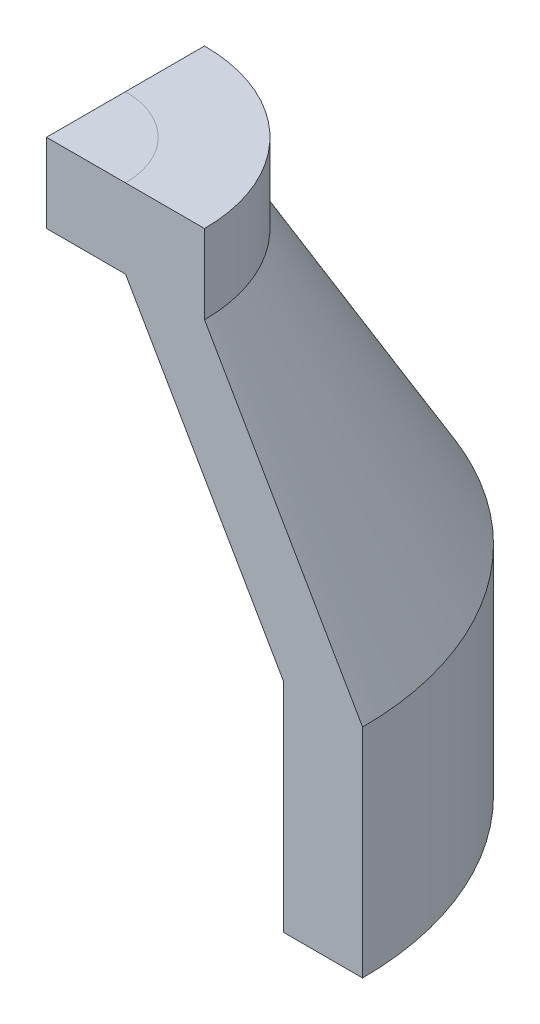
ISO-10303-21;
HEADER;
FILE_DESCRIPTION(('STEP AP214'),'2;1');
FILE_NAME('part.step','',(''),(''),'','','');
FILE_SCHEMA(('AUTOMOTIVE_DESIGN { 1 0 10303 214 1 1 1 1 }'));
ENDSEC;
DATA;
#1=APPLICATION_CONTEXT('core data for automotive mechanical design processes');
#2=APPLICATION_PROTOCOL_DEFINITION('international standard','automotive_design',2000,#1);
#3=PRODUCT_CONTEXT('',#1,'mechanical');
#4=PRODUCT('Part','Part','',(#3));
#5=PRODUCT_RELATED_PRODUCT_CATEGORY('part','',(#4));
#6=PRODUCT_DEFINITION_FORMATION('','',#4);
#7=PRODUCT_DEFINITION_CONTEXT('part definition',#1,'design');
#8=PRODUCT_DEFINITION('design','',#6,#7);
#9=PRODUCT_DEFINITION_SHAPE('','',#8);
#10=(LENGTH_UNIT() NAMED_UNIT(*) SI_UNIT(.MILLI.,.METRE.));
#11=(NAMED_UNIT(*) PLANE_ANGLE_UNIT() SI_UNIT($,.RADIAN.));
#12=(NAMED_UNIT(*) SI_UNIT($,.STERADIAN.) SOLID_ANGLE_UNIT());
#13=UNCERTAINTY_MEASURE_WITH_UNIT(LENGTH_MEASURE(1.E-05),#10,'distance_accuracy_value','');
#14=(GEOMETRIC_REPRESENTATION_CONTEXT(3) GLOBAL_UNCERTAINTY_ASSIGNED_CONTEXT((#13)) GLOBAL_UNIT_ASSIGNED_CONTEXT((#10,
#11,#12)) REPRESENTATION_CONTEXT('',''));
#15=CARTESIAN_POINT('',(0.,0.,0.));
#16=DIRECTION('',(0.,0.,1.));
#17=DIRECTION('',(1.,0.,0.));
#18=AXIS2_PLACEMENT_3D('',#15,#16,#17);
#19=CARTESIAN_POINT('',(0.,0.,0.));
#20=DIRECTION('',(0.,0.,1.));
#21=DIRECTION('',(1.,0.,0.));
#22=AXIS2_PLACEMENT_3D('',#19,#20,#21);
#23=PLANE('',#22);
#24=DIRECTION('',(0.,-1.,0.));
#25=VECTOR('',#24,1.);
#26=CARTESIAN_POINT('',(-1.,-2.75,0.));
#27=LINE('',#26,#25);
#28=CARTESIAN_POINT('',(-1.,2.75,0.));
#29=VERTEX_POINT('',#28);
#30=CARTESIAN_POINT('',(-1.,-2.75,0.));
#31=VERTEX_POINT('',#30);
#32=EDGE_CURVE('E75',#29,#31,#27,.T.);
#33=ORIENTED_EDGE('',*,*,#32,.T.);
#34=DIRECTION('',(1.,0.,0.));
#35=VECTOR('',#34,1.);
#36=CARTESIAN_POINT('',(1.,-2.75,0.));
#37=LINE('',#36,#35);
#38=CARTESIAN_POINT('',(1.,-2.75,0.));
#39=VERTEX_POINT('',#38);
#40=EDGE_CURVE('E69',#31,#39,#37,.T.);
#41=ORIENTED_EDGE('',*,*,#40,.T.);
#42=DIRECTION('',(0.,1.,0.));
#43=VECTOR('',#42,1.);
#44=CARTESIAN_POINT('',(1.,-2.75,0.));
#45=LINE('',#44,#43);
#46=CARTESIAN_POINT('',(1.,2.75,0.));
#47=VERTEX_POINT('',#46);
#48=EDGE_CURVE('E116',#39,#47,#45,.T.);
#49=ORIENTED_EDGE('',*,*,#48,.T.);
#50=DIRECTION('',(-0.499999999999995,0.866025403784441,0.));
#51=VECTOR('',#50,1.);
#52=CARTESIAN_POINT('',(-2.99999999999996,9.67820323027554,0.));
#53=LINE('',#52,#51);
#54=CARTESIAN_POINT('',(-2.99999999999996,9.67820323027554,0.));
#55=VERTEX_POINT('',#54);
#56=EDGE_CURVE('E123',#47,#55,#53,.T.);
#57=ORIENTED_EDGE('',*,*,#56,.T.);
#58=DIRECTION('',(0.,1.,0.));
#59=VECTOR('',#58,1.);
#60=CARTESIAN_POINT('',(-2.99999999999996,11.6782032302755,0.));
#61=LINE('',#60,#59);
#62=CARTESIAN_POINT('',(-2.99999999999996,11.6782032302755,0.));
#63=VERTEX_POINT('',#62);
#64=EDGE_CURVE('E134',#55,#63,#61,.T.);
#65=ORIENTED_EDGE('',*,*,#64,.T.);
#66=DIRECTION('',(-1.,0.,0.));
#67=VECTOR('',#66,1.);
#68=CARTESIAN_POINT('',(-2.99999999999996,11.6782032302755,0.));
#69=LINE('',#68,#67);
#70=CARTESIAN_POINT('',(-4.99999999999996,11.6782032302755,0.));
#71=VERTEX_POINT('',#70);
#72=EDGE_CURVE('E143',#63,#71,#69,.T.);
#73=ORIENTED_EDGE('',*,*,#72,.T.);
#74=DIRECTION('',(-1.,0.,0.));
#75=VECTOR('',#74,1.);
#76=CARTESIAN_POINT('',(-6.99999999999996,11.6782032302755,0.));
#77=LINE('',#76,#75);
#78=CARTESIAN_POINT('',(-6.99999999999997,11.6782032302755,0.));
#79=VERTEX_POINT('',#78);
#80=EDGE_CURVE('E151',#71,#79,#77,.T.);
#81=ORIENTED_EDGE('',*,*,#80,.T.);
#82=DIRECTION('',(0.,-1.,0.));
#83=VECTOR('',#82,1.);
#84=CARTESIAN_POINT('',(-7.,9.67820323027554,0.));
#85=LINE('',#84,#83);
#86=CARTESIAN_POINT('',(-6.99999999999997,9.67820323027554,0.));
#87=VERTEX_POINT('',#86);
#88=EDGE_CURVE('E35',#79,#87,#85,.T.);
#89=ORIENTED_EDGE('',*,*,#88,.T.);
#90=DIRECTION('',(1.,0.,0.));
#91=VECTOR('',#90,1.);
#92=CARTESIAN_POINT('',(-4.99999999999996,9.67820323027554,0.));
#93=LINE('',#92,#91);
#94=CARTESIAN_POINT('',(-4.99999999999996,9.67820323027554,0.));
#95=VERTEX_POINT('',#94);
#96=EDGE_CURVE('E159',#87,#95,#93,.T.);
#97=ORIENTED_EDGE('',*,*,#96,.T.);
#98=DIRECTION('',(0.499999999999995,-0.866025403784442,0.));
#99=VECTOR('',#98,1.);
#100=CARTESIAN_POINT('',(-4.99999999999996,9.67820323027554,0.));
#101=LINE('',#100,#99);
#102=EDGE_CURVE('E80',#95,#29,#101,.T.);
#103=ORIENTED_EDGE('',*,*,#102,.T.);
#104=EDGE_LOOP('',(#33,#41,#49,#57,#65,#73,#81,#89,#97,#103));
#105=FACE_BOUND('',#104,.T.);
#106=ADVANCED_FACE('F32',(#105),#23,.T.);
#107=CARTESIAN_POINT('',(-7.,0.,-7.));
#108=DIRECTION('',(1.,0.,0.));
#109=DIRECTION('',(0.,0.,-1.));
#110=AXIS2_PLACEMENT_3D('',#107,#108,#109);
#111=PLANE('',#110);
#112=DIRECTION('',(0.,-1.,0.));
#113=VECTOR('',#112,1.);
#114=CARTESIAN_POINT('',(-7.,-2.75,-6.));
#115=LINE('',#114,#113);
#116=CARTESIAN_POINT('',(-7.,2.75,-6.));
#117=VERTEX_POINT('',#116);
#118=CARTESIAN_POINT('',(-7.,-2.75,-6.));
#119=VERTEX_POINT('',#118);
#120=EDGE_CURVE('E47',#117,#119,#115,.T.);
#121=ORIENTED_EDGE('',*,*,#120,.F.);
#122=DIRECTION('',(0.,-0.866025403784442,-0.499999999999995));
#123=VECTOR('',#122,1.);
#124=CARTESIAN_POINT('',(-7.,9.67820323027554,-2.00000000000004));
#125=LINE('',#124,#123);
#126=CARTESIAN_POINT('',(-7.,9.67820323027554,-2.00000000000004));
#127=VERTEX_POINT('',#126);
#128=EDGE_CURVE('E56',#127,#117,#125,.T.);
#129=ORIENTED_EDGE('',*,*,#128,.F.);
#130=DIRECTION('',(0.,0.,-1.));
#131=VECTOR('',#130,1.);
#132=CARTESIAN_POINT('',(-7.,9.67820323027554,-2.00000000000004));
#133=LINE('',#132,#131);
#134=EDGE_CURVE('E162',#87,#127,#133,.T.);
#135=ORIENTED_EDGE('',*,*,#134,.F.);
#136=ORIENTED_EDGE('',*,*,#88,.F.);
#137=DIRECTION('',(0.,0.,1.));
#138=VECTOR('',#137,1.);
#139=CARTESIAN_POINT('',(-7.,11.6782032302755,0.));
#140=LINE('',#139,#138);
#141=CARTESIAN_POINT('',(-7.,11.6782032302755,-2.00000000000004));
#142=VERTEX_POINT('',#141);
#143=EDGE_CURVE('E156',#142,#79,#140,.T.);
#144=ORIENTED_EDGE('',*,*,#143,.F.);
#145=DIRECTION('',(0.,0.,1.));
#146=VECTOR('',#145,1.);
#147=CARTESIAN_POINT('',(-7.,11.6782032302755,-4.00000000000004));
#148=LINE('',#147,#146);
#149=CARTESIAN_POINT('',(-7.,11.6782032302755,-4.00000000000004));
#150=VERTEX_POINT('',#149);
#151=EDGE_CURVE('E148',#150,#142,#148,.T.);
#152=ORIENTED_EDGE('',*,*,#151,.F.);
#153=DIRECTION('',(0.,1.,0.));
#154=VECTOR('',#153,1.);
#155=CARTESIAN_POINT('',(-7.,11.6782032302755,-4.00000000000004));
#156=LINE('',#155,#154);
#157=CARTESIAN_POINT('',(-7.,9.67820323027554,-4.00000000000004));
#158=VERTEX_POINT('',#157);
#159=EDGE_CURVE('E140',#158,#150,#156,.T.);
#160=ORIENTED_EDGE('',*,*,#159,.F.);
#161=DIRECTION('',(0.,0.866025403784441,0.499999999999995));
#162=VECTOR('',#161,1.);
#163=CARTESIAN_POINT('',(-7.,9.67820323027554,-4.00000000000004));
#164=LINE('',#163,#162);
#165=CARTESIAN_POINT('',(-7.,2.75,-8.));
#166=VERTEX_POINT('',#165);
#167=EDGE_CURVE('E135',#166,#158,#164,.T.);
#168=ORIENTED_EDGE('',*,*,#167,.F.);
#169=DIRECTION('',(0.,1.,0.));
#170=VECTOR('',#169,1.);
#171=CARTESIAN_POINT('',(-7.,-2.75,-8.));
#172=LINE('',#171,#170);
#173=CARTESIAN_POINT('',(-7.,-2.75,-8.));
#174=VERTEX_POINT('',#173);
#175=EDGE_CURVE('E128',#174,#166,#172,.T.);
#176=ORIENTED_EDGE('',*,*,#175,.F.);
#177=DIRECTION('',(0.,0.,-1.));
#178=VECTOR('',#177,1.);
#179=CARTESIAN_POINT('',(-7.,-2.75,-8.));
#180=LINE('',#179,#178);
#181=EDGE_CURVE('E11',#119,#174,#180,.T.);
#182=ORIENTED_EDGE('',*,*,#181,.F.);
#183=EDGE_LOOP('',(#121,#129,#135,#136,#144,#152,#160,#168,#176,#182));
#184=FACE_BOUND('',#183,.T.);
#185=ADVANCED_FACE('F185',(#184),#111,.F.);
#186=CARTESIAN_POINT('',(-7.,0.,0.));
#187=DIRECTION('',(0.,1.,0.));
#188=DIRECTION('',(0.,0.,1.));
#189=AXIS2_PLACEMENT_3D('',#186,#187,#188);
#190=CYLINDRICAL_SURFACE('',#189,8.);
#191=CARTESIAN_POINT('',(-7.,2.75,0.));
#192=DIRECTION('',(0.,1.,0.));
#193=DIRECTION('',(1.,0.,0.));
#194=AXIS2_PLACEMENT_3D('',#191,#192,#193);
#195=CIRCLE('',#194,8.);
#196=EDGE_CURVE('E120',#47,#166,#195,.T.);
#197=ORIENTED_EDGE('',*,*,#196,.F.);
#198=ORIENTED_EDGE('',*,*,#48,.F.);
#199=CARTESIAN_POINT('',(-7.,-2.75,0.));
#200=DIRECTION('',(0.,1.,0.));
#201=DIRECTION('',(1.,0.,0.));
#202=AXIS2_PLACEMENT_3D('',#199,#200,#201);
#203=CIRCLE('',#202,8.);
#204=EDGE_CURVE('E118',#39,#174,#203,.T.);
#205=ORIENTED_EDGE('',*,*,#204,.T.);
#206=ORIENTED_EDGE('',*,*,#175,.T.);
#207=EDGE_LOOP('',(#197,#198,#205,#206));
#208=FACE_BOUND('',#207,.T.);
#209=ADVANCED_FACE('F117',(#208),#190,.T.);
#210=CARTESIAN_POINT('',(-7.,2.75,0.));
#211=DIRECTION('',(0.,-1.,0.));
#212=DIRECTION('',(0.,0.,-1.));
#213=AXIS2_PLACEMENT_3D('',#210,#211,#212);
#214=CONICAL_SURFACE('',#213,8.,0.523598775598293);
#215=CARTESIAN_POINT('',(-7.,9.67820323027554,0.));
#216=DIRECTION('',(0.,1.,0.));
#217=DIRECTION('',(1.,0.,0.));
#218=AXIS2_PLACEMENT_3D('',#215,#216,#217);
#219=CIRCLE('',#218,4.00000000000004);
#220=EDGE_CURVE('E137',#55,#158,#219,.T.);
#221=ORIENTED_EDGE('',*,*,#220,.F.);
#222=ORIENTED_EDGE('',*,*,#56,.F.);
#223=ORIENTED_EDGE('',*,*,#196,.T.);
#224=ORIENTED_EDGE('',*,*,#167,.T.);
#225=EDGE_LOOP('',(#221,#222,#223,#224));
#226=FACE_BOUND('',#225,.T.);
#227=ADVANCED_FACE('F192',(#226),#214,.T.);
#228=CARTESIAN_POINT('',(-7.,0.,0.));
#229=DIRECTION('',(0.,1.,0.));
#230=DIRECTION('',(0.,0.,1.));
#231=AXIS2_PLACEMENT_3D('',#228,#229,#230);
#232=CYLINDRICAL_SURFACE('',#231,4.00000000000004);
#233=CARTESIAN_POINT('',(-7.,11.6782032302755,0.));
#234=DIRECTION('',(0.,1.,0.));
#235=DIRECTION('',(1.,0.,0.));
#236=AXIS2_PLACEMENT_3D('',#233,#234,#235);
#237=CIRCLE('',#236,4.00000000000004);
#238=EDGE_CURVE('E145',#63,#150,#237,.T.);
#239=ORIENTED_EDGE('',*,*,#238,.F.);
#240=ORIENTED_EDGE('',*,*,#64,.F.);
#241=ORIENTED_EDGE('',*,*,#220,.T.);
#242=ORIENTED_EDGE('',*,*,#159,.T.);
#243=EDGE_LOOP('',(#239,#240,#241,#242));
#244=FACE_BOUND('',#243,.T.);
#245=ADVANCED_FACE('F203',(#244),#232,.T.);
#246=CARTESIAN_POINT('',(-2.99999999999996,11.6782032302755,0.));
#247=DIRECTION('',(0.,-1.,0.));
#248=DIRECTION('',(0.,0.,-1.));
#249=AXIS2_PLACEMENT_3D('',#246,#247,#248);
#250=PLANE('',#249);
#251=CARTESIAN_POINT('',(-7.,11.6782032302755,0.));
#252=DIRECTION('',(0.,1.,0.));
#253=DIRECTION('',(1.,0.,0.));
#254=AXIS2_PLACEMENT_3D('',#251,#252,#253);
#255=CIRCLE('',#254,2.00000000000004);
#256=EDGE_CURVE('E153',#71,#142,#255,.T.);
#257=ORIENTED_EDGE('',*,*,#256,.F.);
#258=ORIENTED_EDGE('',*,*,#72,.F.);
#259=ORIENTED_EDGE('',*,*,#238,.T.);
#260=ORIENTED_EDGE('',*,*,#151,.T.);
#261=EDGE_LOOP('',(#257,#258,#259,#260));
#262=FACE_BOUND('',#261,.T.);
#263=ADVANCED_FACE('F205',(#262),#250,.F.);
#264=CARTESIAN_POINT('',(-6.99999999999996,11.6782032302755,0.));
#265=DIRECTION('',(0.,-1.,0.));
#266=DIRECTION('',(0.,0.,-1.));
#267=AXIS2_PLACEMENT_3D('',#264,#265,#266);
#268=PLANE('',#267);
#269=ORIENTED_EDGE('',*,*,#80,.F.);
#270=ORIENTED_EDGE('',*,*,#256,.T.);
#271=ORIENTED_EDGE('',*,*,#143,.T.);
#272=EDGE_LOOP('',(#269,#270,#271));
#273=FACE_BOUND('',#272,.T.);
#274=ADVANCED_FACE('F208',(#273),#268,.F.);
#275=CARTESIAN_POINT('',(-4.99999999999996,9.67820323027554,0.));
#276=DIRECTION('',(0.,1.,0.));
#277=DIRECTION('',(0.,0.,1.));
#278=AXIS2_PLACEMENT_3D('',#275,#276,#277);
#279=PLANE('',#278);
#280=CARTESIAN_POINT('',(-7.,9.67820323027554,0.));
#281=DIRECTION('',(0.,1.,0.));
#282=DIRECTION('',(1.,0.,0.));
#283=AXIS2_PLACEMENT_3D('',#280,#281,#282);
#284=CIRCLE('',#283,2.00000000000004);
#285=EDGE_CURVE('E165',#95,#127,#284,.T.);
#286=ORIENTED_EDGE('',*,*,#285,.F.);
#287=ORIENTED_EDGE('',*,*,#96,.F.);
#288=ORIENTED_EDGE('',*,*,#134,.T.);
#289=EDGE_LOOP('',(#286,#287,#288));
#290=FACE_BOUND('',#289,.T.);
#291=ADVANCED_FACE('F182',(#290),#279,.F.);
#292=CARTESIAN_POINT('',(-7.,9.67820323027554,0.));
#293=DIRECTION('',(0.,-1.,0.));
#294=DIRECTION('',(0.,0.,-1.));
#295=AXIS2_PLACEMENT_3D('',#292,#293,#294);
#296=CONICAL_SURFACE('',#295,2.00000000000004,0.523598775598293);
#297=CARTESIAN_POINT('',(-7.,2.75,0.));
#298=DIRECTION('',(0.,1.,0.));
#299=DIRECTION('',(1.,0.,0.));
#300=AXIS2_PLACEMENT_3D('',#297,#298,#299);
#301=CIRCLE('',#300,6.);
#302=EDGE_CURVE('E169',#29,#117,#301,.T.);
#303=ORIENTED_EDGE('',*,*,#302,.F.);
#304=ORIENTED_EDGE('',*,*,#102,.F.);
#305=ORIENTED_EDGE('',*,*,#285,.T.);
#306=ORIENTED_EDGE('',*,*,#128,.T.);
#307=EDGE_LOOP('',(#303,#304,#305,#306));
#308=FACE_BOUND('',#307,.T.);
#309=ADVANCED_FACE('F175',(#308),#296,.F.);
#310=CARTESIAN_POINT('',(-7.,0.,0.));
#311=DIRECTION('',(0.,1.,0.));
#312=DIRECTION('',(0.,0.,1.));
#313=AXIS2_PLACEMENT_3D('',#310,#311,#312);
#314=CYLINDRICAL_SURFACE('',#313,6.);
#315=CARTESIAN_POINT('',(-7.,-2.75,0.));
#316=DIRECTION('',(0.,1.,0.));
#317=DIRECTION('',(1.,0.,0.));
#318=AXIS2_PLACEMENT_3D('',#315,#316,#317);
#319=CIRCLE('',#318,6.);
#320=EDGE_CURVE('E40',#31,#119,#319,.T.);
#321=ORIENTED_EDGE('',*,*,#320,.F.);
#322=ORIENTED_EDGE('',*,*,#32,.F.);
#323=ORIENTED_EDGE('',*,*,#302,.T.);
#324=ORIENTED_EDGE('',*,*,#120,.T.);
#325=EDGE_LOOP('',(#321,#322,#323,#324));
#326=FACE_BOUND('',#325,.T.);
#327=ADVANCED_FACE('F173',(#326),#314,.F.);
#328=CARTESIAN_POINT('',(1.,-2.75,0.));
#329=DIRECTION('',(0.,1.,0.));
#330=DIRECTION('',(0.,0.,1.));
#331=AXIS2_PLACEMENT_3D('',#328,#329,#330);
#332=PLANE('',#331);
#333=ORIENTED_EDGE('',*,*,#181,.T.);
#334=ORIENTED_EDGE('',*,*,#204,.F.);
#335=ORIENTED_EDGE('',*,*,#40,.F.);
#336=ORIENTED_EDGE('',*,*,#320,.T.);
#337=EDGE_LOOP('',(#333,#334,#335,#336));
#338=FACE_BOUND('',#337,.T.);
#339=ADVANCED_FACE('F126',(#338),#332,.F.);
#340=CLOSED_SHELL('',(#106,#185,#209,#227,#245,#263,#274,#291,#309,#327,#339));
#341=MANIFOLD_SOLID_BREP('B2',#340);
#342=ADVANCED_BREP_SHAPE_REPRESENTATION('',(#18,#341),#14);
#343=SHAPE_DEFINITION_REPRESENTATION(#9,#342);
ENDSEC;
END-ISO-10303-21;
